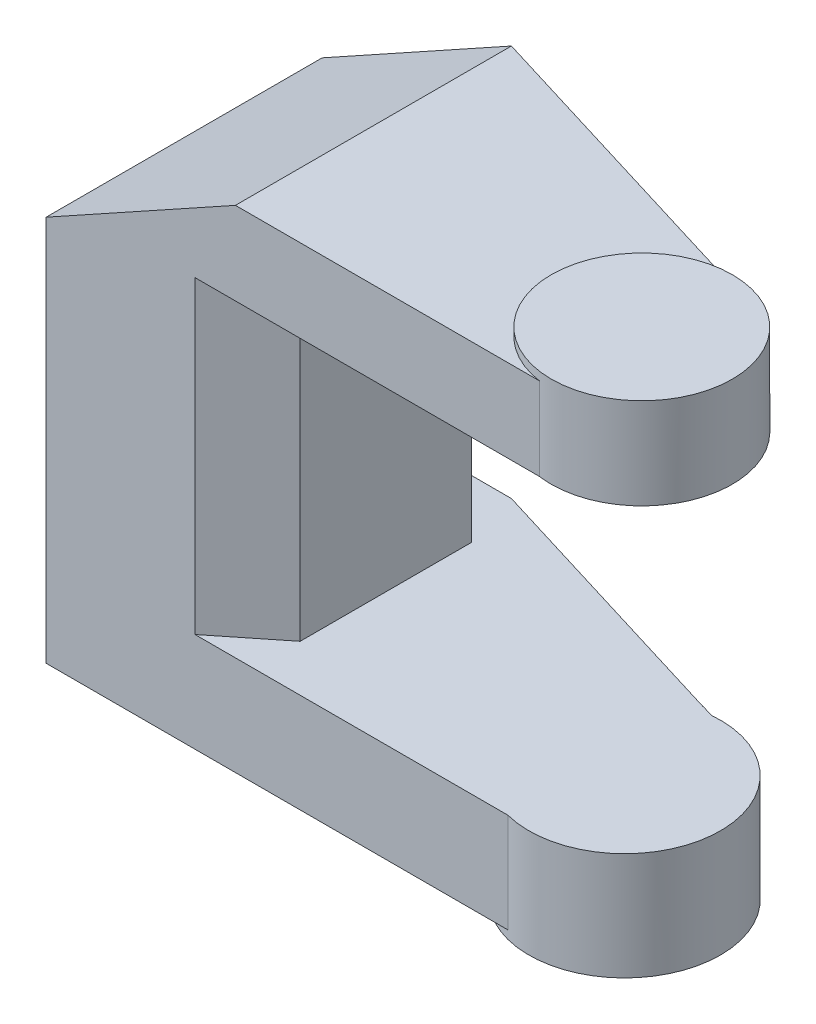
ISO-10303-21;
HEADER;
FILE_DESCRIPTION(('STEP AP214'),'2;1');
FILE_NAME('part.step','',(''),(''),'','','');
FILE_SCHEMA(('AUTOMOTIVE_DESIGN { 1 0 10303 214 1 1 1 1 }'));
ENDSEC;
DATA;
#1=APPLICATION_CONTEXT('core data for automotive mechanical design processes');
#2=APPLICATION_PROTOCOL_DEFINITION('international standard','automotive_design',2000,#1);
#3=PRODUCT_CONTEXT('',#1,'mechanical');
#4=PRODUCT('Part','Part','',(#3));
#5=PRODUCT_RELATED_PRODUCT_CATEGORY('part','',(#4));
#6=PRODUCT_DEFINITION_FORMATION('','',#4);
#7=PRODUCT_DEFINITION_CONTEXT('part definition',#1,'design');
#8=PRODUCT_DEFINITION('design','',#6,#7);
#9=PRODUCT_DEFINITION_SHAPE('','',#8);
#10=(LENGTH_UNIT() NAMED_UNIT(*) SI_UNIT(.MILLI.,.METRE.));
#11=(NAMED_UNIT(*) PLANE_ANGLE_UNIT() SI_UNIT($,.RADIAN.));
#12=(NAMED_UNIT(*) SI_UNIT($,.STERADIAN.) SOLID_ANGLE_UNIT());
#13=UNCERTAINTY_MEASURE_WITH_UNIT(LENGTH_MEASURE(1.E-05),#10,'distance_accuracy_value','');
#14=(GEOMETRIC_REPRESENTATION_CONTEXT(3) GLOBAL_UNCERTAINTY_ASSIGNED_CONTEXT((#13)) GLOBAL_UNIT_ASSIGNED_CONTEXT((#10,
#11,#12)) REPRESENTATION_CONTEXT('',''));
#15=CARTESIAN_POINT('',(0.,0.,0.));
#16=DIRECTION('',(0.,0.,1.));
#17=DIRECTION('',(1.,0.,0.));
#18=AXIS2_PLACEMENT_3D('',#15,#16,#17);
#19=CARTESIAN_POINT('',(421.438035453046,370.,-250.));
#20=DIRECTION('',(0.,1.,0.));
#21=DIRECTION('',(-1.,0.,0.));
#22=AXIS2_PLACEMENT_3D('',#19,#20,#21);
#23=PLANE('',#22);
#24=DIRECTION('',(0.781457807213603,0.,-0.623958087971385));
#25=VECTOR('',#24,1.);
#26=CARTESIAN_POINT('',(134.808708211828,370.,0.));
#27=LINE('',#26,#25);
#28=CARTESIAN_POINT('',(134.808708211828,370.,0.));
#29=VERTEX_POINT('',#28);
#30=CARTESIAN_POINT('',(187.780197762606,370.,-42.2952960889234));
#31=VERTEX_POINT('',#30);
#32=EDGE_CURVE('E54',#29,#31,#27,.T.);
#33=ORIENTED_EDGE('',*,*,#32,.T.);
#34=DIRECTION('',(0.,0.,-1.));
#35=VECTOR('',#34,1.);
#36=CARTESIAN_POINT('',(187.780197762606,370.,-42.2952960889234));
#37=LINE('',#36,#35);
#38=CARTESIAN_POINT('',(187.780197762606,370.,-197.600080778614));
#39=VERTEX_POINT('',#38);
#40=EDGE_CURVE('E58',#31,#39,#37,.T.);
#41=ORIENTED_EDGE('',*,*,#40,.T.);
#42=DIRECTION('',(-0.710931909700484,0.,-0.703260847601815));
#43=VECTOR('',#42,1.);
#44=CARTESIAN_POINT('',(187.780197762606,370.,-197.600080778614));
#45=LINE('',#44,#43);
#46=CARTESIAN_POINT('',(134.808708211828,370.,-250.));
#47=VERTEX_POINT('',#46);
#48=EDGE_CURVE('E294',#39,#47,#45,.T.);
#49=ORIENTED_EDGE('',*,*,#48,.T.);
#50=DIRECTION('',(-1.,0.,0.));
#51=VECTOR('',#50,1.);
#52=CARTESIAN_POINT('',(421.438035453046,370.,-250.));
#53=LINE('',#52,#51);
#54=CARTESIAN_POINT('',(171.438035453046,370.,-250.));
#55=VERTEX_POINT('',#54);
#56=EDGE_CURVE('E219',#55,#47,#53,.T.);
#57=ORIENTED_EDGE('',*,*,#56,.F.);
#58=DIRECTION('',(0.956304755963036,0.,0.292371704722734));
#59=VECTOR('',#58,1.);
#60=CARTESIAN_POINT('',(400.067732022427,370.,-180.100887066157));
#61=LINE('',#60,#59);
#62=CARTESIAN_POINT('',(421.438035453046,370.,-173.567329635336));
#63=VERTEX_POINT('',#62);
#64=EDGE_CURVE('E211',#55,#63,#61,.T.);
#65=ORIENTED_EDGE('',*,*,#64,.T.);
#66=DIRECTION('',(0.957269223575964,0.,0.289198260012523));
#67=VECTOR('',#66,1.);
#68=CARTESIAN_POINT('',(458.366845573691,370.,-162.410857278136));
#69=LINE('',#68,#67);
#70=CARTESIAN_POINT('',(455.863286469266,370.,-163.167201385945));
#71=VERTEX_POINT('',#70);
#72=EDGE_CURVE('E259',#63,#71,#69,.T.);
#73=ORIENTED_EDGE('',*,*,#72,.T.);
#74=CARTESIAN_POINT('',(458.366845573691,370.,-81.205428639068));
#75=DIRECTION('',(0.,1.,0.));
#76=DIRECTION('',(-1.,0.,0.));
#77=AXIS2_PLACEMENT_3D('',#74,#75,#76);
#78=CIRCLE('',#77,81.9999999999999);
#79=CARTESIAN_POINT('',(446.979204924934,370.,0.));
#80=VERTEX_POINT('',#79);
#81=EDGE_CURVE('E254',#71,#80,#78,.F.);
#82=ORIENTED_EDGE('',*,*,#81,.T.);
#83=DIRECTION('',(-1.,0.,0.));
#84=VECTOR('',#83,1.);
#85=CARTESIAN_POINT('',(421.438035453046,370.,0.));
#86=LINE('',#85,#84);
#87=EDGE_CURVE('E170',#80,#29,#86,.T.);
#88=ORIENTED_EDGE('',*,*,#87,.T.);
#89=EDGE_LOOP('',(#33,#41,#49,#57,#65,#73,#82,#88));
#90=FACE_BOUND('',#89,.T.);
#91=ADVANCED_FACE('F39',(#90),#23,.F.);
#92=CARTESIAN_POINT('',(134.808708211828,90.,-250.));
#93=DIRECTION('',(0.,-1.,0.));
#94=DIRECTION('',(0.,0.,-1.));
#95=AXIS2_PLACEMENT_3D('',#92,#93,#94);
#96=PLANE('',#95);
#97=DIRECTION('',(0.781457807213603,0.,-0.623958087971385));
#98=VECTOR('',#97,1.);
#99=CARTESIAN_POINT('',(134.808708211828,90.,0.));
#100=LINE('',#99,#98);
#101=CARTESIAN_POINT('',(134.808708211828,90.,0.));
#102=VERTEX_POINT('',#101);
#103=CARTESIAN_POINT('',(187.780197762606,90.,-42.2952960889234));
#104=VERTEX_POINT('',#103);
#105=EDGE_CURVE('E160',#102,#104,#100,.T.);
#106=ORIENTED_EDGE('',*,*,#105,.F.);
#107=DIRECTION('',(1.,0.,0.));
#108=VECTOR('',#107,1.);
#109=CARTESIAN_POINT('',(134.808708211828,90.,0.));
#110=LINE('',#109,#108);
#111=CARTESIAN_POINT('',(418.196086358207,90.,0.));
#112=VERTEX_POINT('',#111);
#113=EDGE_CURVE('E147',#102,#112,#110,.T.);
#114=ORIENTED_EDGE('',*,*,#113,.T.);
#115=CARTESIAN_POINT('',(440.,90.,-84.0378724923398));
#116=DIRECTION('',(0.,1.,0.));
#117=DIRECTION('',(0.,0.,1.));
#118=AXIS2_PLACEMENT_3D('',#115,#116,#117);
#119=CIRCLE('',#118,86.8203585752647);
#120=CARTESIAN_POINT('',(432.068632190301,90.,-170.495191834341));
#121=VERTEX_POINT('',#120);
#122=EDGE_CURVE('E245',#112,#121,#119,.T.);
#123=ORIENTED_EDGE('',*,*,#122,.T.);
#124=DIRECTION('',(0.956487174232322,0.,0.29177437435297));
#125=VECTOR('',#124,1.);
#126=CARTESIAN_POINT('',(171.438035453046,90.,-250.));
#127=LINE('',#126,#125);
#128=CARTESIAN_POINT('',(421.438035453046,90.,-173.738032716657));
#129=VERTEX_POINT('',#128);
#130=EDGE_CURVE('E262',#129,#121,#127,.T.);
#131=ORIENTED_EDGE('',*,*,#130,.F.);
#132=DIRECTION('',(0.,0.,1.));
#133=VECTOR('',#132,1.);
#134=CARTESIAN_POINT('',(421.438035453046,90.,-250.));
#135=LINE('',#134,#133);
#136=CARTESIAN_POINT('',(421.438035453046,90.,-173.567329635336));
#137=VERTEX_POINT('',#136);
#138=EDGE_CURVE('E210',#129,#137,#135,.T.);
#139=ORIENTED_EDGE('',*,*,#138,.T.);
#140=DIRECTION('',(-0.956304755963036,0.,-0.292371704722734));
#141=VECTOR('',#140,1.);
#142=CARTESIAN_POINT('',(137.939827562245,90.,-260.241429926099));
#143=LINE('',#142,#141);
#144=CARTESIAN_POINT('',(171.438035453046,90.,-250.));
#145=VERTEX_POINT('',#144);
#146=EDGE_CURVE('E199',#137,#145,#143,.T.);
#147=ORIENTED_EDGE('',*,*,#146,.T.);
#148=DIRECTION('',(1.,0.,0.));
#149=VECTOR('',#148,1.);
#150=CARTESIAN_POINT('',(134.808708211828,90.,-250.));
#151=LINE('',#150,#149);
#152=CARTESIAN_POINT('',(134.808708211828,90.,-250.));
#153=VERTEX_POINT('',#152);
#154=EDGE_CURVE('E180',#153,#145,#151,.T.);
#155=ORIENTED_EDGE('',*,*,#154,.F.);
#156=DIRECTION('',(-0.710931909700484,0.,-0.703260847601815));
#157=VECTOR('',#156,1.);
#158=CARTESIAN_POINT('',(187.780197762606,90.,-197.600080778614));
#159=LINE('',#158,#157);
#160=CARTESIAN_POINT('',(187.780197762606,90.,-197.600080778614));
#161=VERTEX_POINT('',#160);
#162=EDGE_CURVE('E295',#161,#153,#159,.T.);
#163=ORIENTED_EDGE('',*,*,#162,.F.);
#164=DIRECTION('',(0.,0.,-1.));
#165=VECTOR('',#164,1.);
#166=CARTESIAN_POINT('',(187.780197762606,90.,-42.2952960889234));
#167=LINE('',#166,#165);
#168=EDGE_CURVE('E163',#104,#161,#167,.T.);
#169=ORIENTED_EDGE('',*,*,#168,.F.);
#170=EDGE_LOOP('',(#106,#114,#123,#131,#139,#147,#155,#163,#169));
#171=FACE_BOUND('',#170,.T.);
#172=ADVANCED_FACE('F161',(#171),#96,.F.);
#173=CARTESIAN_POINT('',(360.,0.,-250.));
#174=DIRECTION('',(0.,1.,0.));
#175=DIRECTION('',(-1.,0.,0.));
#176=AXIS2_PLACEMENT_3D('',#173,#174,#175);
#177=PLANE('',#176);
#178=CARTESIAN_POINT('',(440.,0.,-84.0378724923398));
#179=DIRECTION('',(0.,-1.,0.));
#180=DIRECTION('',(1.,0.,0.));
#181=AXIS2_PLACEMENT_3D('',#178,#179,#180);
#182=CIRCLE('',#181,86.8203585752647);
#183=CARTESIAN_POINT('',(418.196086358207,0.,0.));
#184=VERTEX_POINT('',#183);
#185=CARTESIAN_POINT('',(432.068632190301,0.,-170.495191834341));
#186=VERTEX_POINT('',#185);
#187=EDGE_CURVE('E248',#184,#186,#182,.T.);
#188=ORIENTED_EDGE('',*,*,#187,.F.);
#189=DIRECTION('',(-1.,0.,0.));
#190=VECTOR('',#189,1.);
#191=CARTESIAN_POINT('',(360.,0.,0.));
#192=LINE('',#191,#190);
#193=CARTESIAN_POINT('',(0.,0.,0.));
#194=VERTEX_POINT('',#193);
#195=EDGE_CURVE('E223',#184,#194,#192,.T.);
#196=ORIENTED_EDGE('',*,*,#195,.T.);
#197=DIRECTION('',(0.,0.,1.));
#198=VECTOR('',#197,1.);
#199=CARTESIAN_POINT('',(0.,0.,-250.));
#200=LINE('',#199,#198);
#201=CARTESIAN_POINT('',(0.,0.,-250.));
#202=VERTEX_POINT('',#201);
#203=EDGE_CURVE('E183',#202,#194,#200,.T.);
#204=ORIENTED_EDGE('',*,*,#203,.F.);
#205=DIRECTION('',(-1.,0.,0.));
#206=VECTOR('',#205,1.);
#207=CARTESIAN_POINT('',(360.,0.,-250.));
#208=LINE('',#207,#206);
#209=CARTESIAN_POINT('',(171.438035453046,0.,-250.));
#210=VERTEX_POINT('',#209);
#211=EDGE_CURVE('E157',#210,#202,#208,.T.);
#212=ORIENTED_EDGE('',*,*,#211,.F.);
#213=DIRECTION('',(0.956304755963036,0.,0.292371704722734));
#214=VECTOR('',#213,1.);
#215=CARTESIAN_POINT('',(343.881494408632,0.,-197.278743780421));
#216=LINE('',#215,#214);
#217=CARTESIAN_POINT('',(421.438035453046,0.,-173.567329635336));
#218=VERTEX_POINT('',#217);
#219=EDGE_CURVE('E202',#210,#218,#216,.T.);
#220=ORIENTED_EDGE('',*,*,#219,.T.);
#221=DIRECTION('',(0.,0.,-1.));
#222=VECTOR('',#221,1.);
#223=CARTESIAN_POINT('',(421.438035453046,0.,-250.));
#224=LINE('',#223,#222);
#225=CARTESIAN_POINT('',(421.438035453046,0.,-173.738032716657));
#226=VERTEX_POINT('',#225);
#227=EDGE_CURVE('E226',#218,#226,#224,.T.);
#228=ORIENTED_EDGE('',*,*,#227,.T.);
#229=DIRECTION('',(0.956487174232322,0.,0.29177437435297));
#230=VECTOR('',#229,1.);
#231=CARTESIAN_POINT('',(343.947288994267,0.,-197.376419801462));
#232=LINE('',#231,#230);
#233=EDGE_CURVE('E268',#226,#186,#232,.T.);
#234=ORIENTED_EDGE('',*,*,#233,.T.);
#235=EDGE_LOOP('',(#188,#196,#204,#212,#220,#228,#234));
#236=FACE_BOUND('',#235,.T.);
#237=ADVANCED_FACE('F41',(#236),#177,.F.);
#238=CARTESIAN_POINT('',(171.438035453046,445.,-250.));
#239=DIRECTION('',(0.,-1.,0.));
#240=DIRECTION('',(0.,0.,-1.));
#241=AXIS2_PLACEMENT_3D('',#238,#239,#240);
#242=PLANE('',#241);
#243=CARTESIAN_POINT('',(458.366845573691,445.,-81.205428639068));
#244=DIRECTION('',(0.,1.,0.));
#245=DIRECTION('',(0.,0.,1.));
#246=AXIS2_PLACEMENT_3D('',#243,#244,#245);
#247=CIRCLE('',#246,81.9999999999999);
#248=CARTESIAN_POINT('',(455.863286469266,445.,-163.167201385945));
#249=VERTEX_POINT('',#248);
#250=CARTESIAN_POINT('',(446.979204924934,445.,0.));
#251=VERTEX_POINT('',#250);
#252=EDGE_CURVE('E233',#249,#251,#247,.T.);
#253=ORIENTED_EDGE('',*,*,#252,.F.);
#254=DIRECTION('',(-0.957269223575964,0.,-0.289198260012523));
#255=VECTOR('',#254,1.);
#256=CARTESIAN_POINT('',(458.366845573691,445.,-162.410857278136));
#257=LINE('',#256,#255);
#258=CARTESIAN_POINT('',(421.438035453046,445.,-173.567329635336));
#259=VERTEX_POINT('',#258);
#260=EDGE_CURVE('E257',#249,#259,#257,.T.);
#261=ORIENTED_EDGE('',*,*,#260,.T.);
#262=DIRECTION('',(0.956304755963036,0.,0.292371704722734));
#263=VECTOR('',#262,1.);
#264=CARTESIAN_POINT('',(171.438035453046,445.,-250.));
#265=LINE('',#264,#263);
#266=CARTESIAN_POINT('',(171.438035453046,445.,-250.));
#267=VERTEX_POINT('',#266);
#268=EDGE_CURVE('E271',#267,#259,#265,.T.);
#269=ORIENTED_EDGE('',*,*,#268,.F.);
#270=DIRECTION('',(0.,0.,1.));
#271=VECTOR('',#270,1.);
#272=CARTESIAN_POINT('',(171.438035453046,445.,-250.));
#273=LINE('',#272,#271);
#274=CARTESIAN_POINT('',(171.438035453046,445.,0.));
#275=VERTEX_POINT('',#274);
#276=EDGE_CURVE('E176',#267,#275,#273,.T.);
#277=ORIENTED_EDGE('',*,*,#276,.T.);
#278=DIRECTION('',(1.,0.,0.));
#279=VECTOR('',#278,1.);
#280=CARTESIAN_POINT('',(171.438035453046,445.,0.));
#281=LINE('',#280,#279);
#282=EDGE_CURVE('E172',#275,#251,#281,.T.);
#283=ORIENTED_EDGE('',*,*,#282,.T.);
#284=EDGE_LOOP('',(#253,#261,#269,#277,#283));
#285=FACE_BOUND('',#284,.T.);
#286=ADVANCED_FACE('F232',(#285),#242,.F.);
#287=CARTESIAN_POINT('',(0.,0.,-250.));
#288=DIRECTION('',(1.,0.,0.));
#289=DIRECTION('',(0.,0.,-1.));
#290=AXIS2_PLACEMENT_3D('',#287,#288,#289);
#291=PLANE('',#290);
#292=DIRECTION('',(0.,1.,0.));
#293=VECTOR('',#292,1.);
#294=CARTESIAN_POINT('',(0.,0.,0.));
#295=LINE('',#294,#293);
#296=CARTESIAN_POINT('',(0.,350.,0.));
#297=VERTEX_POINT('',#296);
#298=EDGE_CURVE('E225',#194,#297,#295,.T.);
#299=ORIENTED_EDGE('',*,*,#298,.T.);
#300=DIRECTION('',(0.,0.,1.));
#301=VECTOR('',#300,1.);
#302=CARTESIAN_POINT('',(0.,350.,-250.));
#303=LINE('',#302,#301);
#304=CARTESIAN_POINT('',(0.,350.,-250.));
#305=VERTEX_POINT('',#304);
#306=EDGE_CURVE('E179',#305,#297,#303,.T.);
#307=ORIENTED_EDGE('',*,*,#306,.F.);
#308=DIRECTION('',(0.,1.,0.));
#309=VECTOR('',#308,1.);
#310=CARTESIAN_POINT('',(0.,0.,-250.));
#311=LINE('',#310,#309);
#312=EDGE_CURVE('E284',#202,#305,#311,.T.);
#313=ORIENTED_EDGE('',*,*,#312,.F.);
#314=ORIENTED_EDGE('',*,*,#203,.T.);
#315=EDGE_LOOP('',(#299,#307,#313,#314));
#316=FACE_BOUND('',#315,.T.);
#317=ADVANCED_FACE('F319',(#316),#291,.F.);
#318=CARTESIAN_POINT('',(0.,350.,-250.));
#319=DIRECTION('',(0.484693877551021,-0.874683854352277,0.));
#320=DIRECTION('',(0.874683854352277,0.484693877551021,0.));
#321=AXIS2_PLACEMENT_3D('',#318,#319,#320);
#322=PLANE('',#321);
#323=DIRECTION('',(0.874683854352277,0.484693877551021,0.));
#324=VECTOR('',#323,1.);
#325=CARTESIAN_POINT('',(0.,350.,0.));
#326=LINE('',#325,#324);
#327=EDGE_CURVE('E228',#297,#275,#326,.T.);
#328=ORIENTED_EDGE('',*,*,#327,.T.);
#329=ORIENTED_EDGE('',*,*,#276,.F.);
#330=DIRECTION('',(0.874683854352277,0.484693877551021,0.));
#331=VECTOR('',#330,1.);
#332=CARTESIAN_POINT('',(0.,350.,-250.));
#333=LINE('',#332,#331);
#334=EDGE_CURVE('E286',#305,#267,#333,.T.);
#335=ORIENTED_EDGE('',*,*,#334,.F.);
#336=ORIENTED_EDGE('',*,*,#306,.T.);
#337=EDGE_LOOP('',(#328,#329,#335,#336));
#338=FACE_BOUND('',#337,.T.);
#339=ADVANCED_FACE('F322',(#338),#322,.F.);
#340=CARTESIAN_POINT('',(0.,0.,-250.));
#341=DIRECTION('',(0.,0.,-1.));
#342=DIRECTION('',(-1.,0.,0.));
#343=AXIS2_PLACEMENT_3D('',#340,#341,#342);
#344=PLANE('',#343);
#345=DIRECTION('',(0.,1.,0.));
#346=VECTOR('',#345,1.);
#347=CARTESIAN_POINT('',(171.438035453046,0.,-250.));
#348=LINE('',#347,#346);
#349=EDGE_CURVE('E187',#210,#145,#348,.T.);
#350=ORIENTED_EDGE('',*,*,#349,.F.);
#351=ORIENTED_EDGE('',*,*,#211,.T.);
#352=ORIENTED_EDGE('',*,*,#312,.T.);
#353=ORIENTED_EDGE('',*,*,#334,.T.);
#354=EDGE_CURVE('E186',#55,#267,#348,.T.);
#355=ORIENTED_EDGE('',*,*,#354,.F.);
#356=ORIENTED_EDGE('',*,*,#56,.T.);
#357=DIRECTION('',(0.,-1.,0.));
#358=VECTOR('',#357,1.);
#359=CARTESIAN_POINT('',(134.808708211828,370.,-250.));
#360=LINE('',#359,#358);
#361=EDGE_CURVE('E217',#47,#153,#360,.T.);
#362=ORIENTED_EDGE('',*,*,#361,.T.);
#363=ORIENTED_EDGE('',*,*,#154,.T.);
#364=EDGE_LOOP('',(#350,#351,#352,#353,#355,#356,#362,#363));
#365=FACE_BOUND('',#364,.T.);
#366=ADVANCED_FACE('F214',(#365),#344,.T.);
#367=CARTESIAN_POINT('',(0.,0.,0.));
#368=DIRECTION('',(0.,0.,-1.));
#369=DIRECTION('',(-1.,0.,0.));
#370=AXIS2_PLACEMENT_3D('',#367,#368,#369);
#371=PLANE('',#370);
#372=ORIENTED_EDGE('',*,*,#195,.F.);
#373=DIRECTION('',(0.,1.,0.));
#374=VECTOR('',#373,1.);
#375=CARTESIAN_POINT('',(418.196086358207,-245.565057174469,0.));
#376=LINE('',#375,#374);
#377=EDGE_CURVE('E154',#184,#112,#376,.T.);
#378=ORIENTED_EDGE('',*,*,#377,.T.);
#379=ORIENTED_EDGE('',*,*,#113,.F.);
#380=DIRECTION('',(0.,-1.,0.));
#381=VECTOR('',#380,1.);
#382=CARTESIAN_POINT('',(134.808708211828,370.,0.));
#383=LINE('',#382,#381);
#384=EDGE_CURVE('E152',#29,#102,#383,.T.);
#385=ORIENTED_EDGE('',*,*,#384,.F.);
#386=ORIENTED_EDGE('',*,*,#87,.F.);
#387=DIRECTION('',(0.,1.,0.));
#388=VECTOR('',#387,1.);
#389=CARTESIAN_POINT('',(446.979204924934,138.068975770813,0.));
#390=LINE('',#389,#388);
#391=EDGE_CURVE('E239',#80,#251,#390,.T.);
#392=ORIENTED_EDGE('',*,*,#391,.T.);
#393=ORIENTED_EDGE('',*,*,#282,.F.);
#394=ORIENTED_EDGE('',*,*,#327,.F.);
#395=ORIENTED_EDGE('',*,*,#298,.F.);
#396=EDGE_LOOP('',(#372,#378,#379,#385,#386,#392,#393,#394,#395));
#397=FACE_BOUND('',#396,.T.);
#398=ADVANCED_FACE('F149',(#397),#371,.F.);
#399=CARTESIAN_POINT('',(171.438035453046,-55.0000000000001,-250.));
#400=DIRECTION('',(-0.292371704722734,0.,0.956304755963036));
#401=DIRECTION('',(0.956304755963036,0.,0.292371704722734));
#402=AXIS2_PLACEMENT_3D('',#399,#400,#401);
#403=PLANE('',#402);
#404=ORIENTED_EDGE('',*,*,#354,.T.);
#405=ORIENTED_EDGE('',*,*,#268,.T.);
#406=DIRECTION('',(0.,1.,0.));
#407=VECTOR('',#406,1.);
#408=CARTESIAN_POINT('',(421.438035453046,-55.0000000000001,-173.567329635336));
#409=LINE('',#408,#407);
#410=EDGE_CURVE('E274',#63,#259,#409,.T.);
#411=ORIENTED_EDGE('',*,*,#410,.F.);
#412=ORIENTED_EDGE('',*,*,#64,.F.);
#413=EDGE_LOOP('',(#404,#405,#411,#412));
#414=FACE_BOUND('',#413,.T.);
#415=ADVANCED_FACE('F373',(#414),#403,.F.);
#416=CARTESIAN_POINT('',(421.438035453046,-55.0000000000001,-173.567329635336));
#417=DIRECTION('',(1.,0.,0.));
#418=DIRECTION('',(0.,0.,-1.));
#419=AXIS2_PLACEMENT_3D('',#416,#417,#418);
#420=PLANE('',#419);
#421=ORIENTED_EDGE('',*,*,#138,.F.);
#422=DIRECTION('',(0.,-1.,0.));
#423=VECTOR('',#422,1.);
#424=CARTESIAN_POINT('',(421.438035453046,-55.0000000000001,-173.738032716657));
#425=LINE('',#424,#423);
#426=EDGE_CURVE('E265',#129,#226,#425,.T.);
#427=ORIENTED_EDGE('',*,*,#426,.T.);
#428=ORIENTED_EDGE('',*,*,#227,.F.);
#429=EDGE_CURVE('E212',#218,#137,#409,.T.);
#430=ORIENTED_EDGE('',*,*,#429,.T.);
#431=EDGE_LOOP('',(#421,#427,#428,#430));
#432=FACE_BOUND('',#431,.T.);
#433=ADVANCED_FACE('F314',(#432),#420,.F.);
#434=ORIENTED_EDGE('',*,*,#349,.T.);
#435=ORIENTED_EDGE('',*,*,#146,.F.);
#436=ORIENTED_EDGE('',*,*,#429,.F.);
#437=ORIENTED_EDGE('',*,*,#219,.F.);
#438=EDGE_LOOP('',(#434,#435,#436,#437));
#439=FACE_BOUND('',#438,.T.);
#440=ADVANCED_FACE('F197',(#439),#403,.F.);
#441=CARTESIAN_POINT('',(171.438035453046,-410.,-250.));
#442=DIRECTION('',(-0.29177437435297,0.,0.956487174232322));
#443=DIRECTION('',(0.956487174232322,0.,0.29177437435297));
#444=AXIS2_PLACEMENT_3D('',#441,#442,#443);
#445=PLANE('',#444);
#446=ORIENTED_EDGE('',*,*,#130,.T.);
#447=DIRECTION('',(0.,1.,0.));
#448=VECTOR('',#447,1.);
#449=CARTESIAN_POINT('',(432.068632190301,-245.565057174469,-170.495191834341));
#450=LINE('',#449,#448);
#451=EDGE_CURVE('E11',#121,#186,#450,.F.);
#452=ORIENTED_EDGE('',*,*,#451,.T.);
#453=ORIENTED_EDGE('',*,*,#233,.F.);
#454=ORIENTED_EDGE('',*,*,#426,.F.);
#455=EDGE_LOOP('',(#446,#452,#453,#454));
#456=FACE_BOUND('',#455,.T.);
#457=ADVANCED_FACE('F312',(#456),#445,.F.);
#458=CARTESIAN_POINT('',(458.366845573691,192.086546499993,-162.410857278136));
#459=DIRECTION('',(0.289198260012523,0.,-0.957269223575964));
#460=DIRECTION('',(-0.957269223575964,0.,-0.289198260012523));
#461=AXIS2_PLACEMENT_3D('',#458,#459,#460);
#462=PLANE('',#461);
#463=DIRECTION('',(0.,1.,0.));
#464=VECTOR('',#463,1.);
#465=CARTESIAN_POINT('',(455.863286469266,138.068975770813,-163.167201385945));
#466=LINE('',#465,#464);
#467=EDGE_CURVE('E47',#71,#249,#466,.T.);
#468=ORIENTED_EDGE('',*,*,#467,.F.);
#469=ORIENTED_EDGE('',*,*,#72,.F.);
#470=ORIENTED_EDGE('',*,*,#410,.T.);
#471=ORIENTED_EDGE('',*,*,#260,.F.);
#472=EDGE_LOOP('',(#468,#469,#470,#471));
#473=FACE_BOUND('',#472,.T.);
#474=ADVANCED_FACE('F418',(#473),#462,.T.);
#475=CARTESIAN_POINT('',(458.366845573691,138.068975770813,-81.205428639068));
#476=DIRECTION('',(0.,1.,0.));
#477=DIRECTION('',(0.,0.,1.));
#478=AXIS2_PLACEMENT_3D('',#475,#476,#477);
#479=CYLINDRICAL_SURFACE('',#478,81.9999999999999);
#480=ORIENTED_EDGE('',*,*,#391,.F.);
#481=ORIENTED_EDGE('',*,*,#81,.F.);
#482=ORIENTED_EDGE('',*,*,#467,.T.);
#483=ORIENTED_EDGE('',*,*,#252,.T.);
#484=EDGE_LOOP('',(#480,#481,#482,#483));
#485=FACE_BOUND('',#484,.T.);
#486=CARTESIAN_POINT('',(458.366845573691,452.5,-81.205428639068));
#487=DIRECTION('',(0.,1.,0.));
#488=DIRECTION('',(0.,0.,1.));
#489=AXIS2_PLACEMENT_3D('',#486,#487,#488);
#490=CIRCLE('',#489,81.9999999999999);
#491=CARTESIAN_POINT('',(458.366845573691,452.5,0.794571360931987));
#492=VERTEX_POINT('',#491);
#493=EDGE_CURVE('E241',#492,#492,#490,.T.);
#494=ORIENTED_EDGE('',*,*,#493,.F.);
#495=EDGE_LOOP('',(#494));
#496=FACE_BOUND('',#495,.T.);
#497=ADVANCED_FACE('F237',(#485,#496),#479,.T.);
#498=CARTESIAN_POINT('',(440.,-245.565057174469,-84.0378724923398));
#499=DIRECTION('',(0.,1.,0.));
#500=DIRECTION('',(0.,0.,1.));
#501=AXIS2_PLACEMENT_3D('',#498,#499,#500);
#502=CYLINDRICAL_SURFACE('',#501,86.8203585752647);
#503=ORIENTED_EDGE('',*,*,#377,.F.);
#504=ORIENTED_EDGE('',*,*,#187,.T.);
#505=ORIENTED_EDGE('',*,*,#451,.F.);
#506=ORIENTED_EDGE('',*,*,#122,.F.);
#507=EDGE_LOOP('',(#503,#504,#505,#506));
#508=FACE_BOUND('',#507,.T.);
#509=CARTESIAN_POINT('',(440.,-7.5,-84.0378724923398));
#510=DIRECTION('',(0.,-1.,0.));
#511=DIRECTION('',(1.,0.,0.));
#512=AXIS2_PLACEMENT_3D('',#509,#510,#511);
#513=CIRCLE('',#512,86.8203585752647);
#514=CARTESIAN_POINT('',(526.820358575265,-7.5,-84.0378724923398));
#515=VERTEX_POINT('',#514);
#516=EDGE_CURVE('E242',#515,#515,#513,.T.);
#517=ORIENTED_EDGE('',*,*,#516,.F.);
#518=EDGE_LOOP('',(#517));
#519=FACE_BOUND('',#518,.T.);
#520=ADVANCED_FACE('F307',(#508,#519),#502,.T.);
#521=CARTESIAN_POINT('',(458.366845573691,452.5,-81.205428639068));
#522=DIRECTION('',(0.,1.,0.));
#523=DIRECTION('',(0.,0.,1.));
#524=AXIS2_PLACEMENT_3D('',#521,#522,#523);
#525=PLANE('',#524);
#526=ORIENTED_EDGE('',*,*,#493,.T.);
#527=EDGE_LOOP('',(#526));
#528=FACE_BOUND('',#527,.T.);
#529=ADVANCED_FACE('F409',(#528),#525,.T.);
#530=CARTESIAN_POINT('',(440.,-7.5,-84.0378724923398));
#531=DIRECTION('',(0.,-1.,0.));
#532=DIRECTION('',(1.,0.,0.));
#533=AXIS2_PLACEMENT_3D('',#530,#531,#532);
#534=PLANE('',#533);
#535=ORIENTED_EDGE('',*,*,#516,.T.);
#536=EDGE_LOOP('',(#535));
#537=FACE_BOUND('',#536,.T.);
#538=ADVANCED_FACE('F385',(#537),#534,.T.);
#539=CARTESIAN_POINT('',(134.808708211828,625.550344756622,0.));
#540=DIRECTION('',(-0.623958087971385,0.,-0.781457807213603));
#541=DIRECTION('',(-0.781457807213603,0.,0.623958087971385));
#542=AXIS2_PLACEMENT_3D('',#539,#540,#541);
#543=PLANE('',#542);
#544=ORIENTED_EDGE('',*,*,#32,.F.);
#545=ORIENTED_EDGE('',*,*,#384,.T.);
#546=ORIENTED_EDGE('',*,*,#105,.T.);
#547=DIRECTION('',(0.,-1.,0.));
#548=VECTOR('',#547,1.);
#549=CARTESIAN_POINT('',(187.780197762606,625.550344756622,-42.2952960889234));
#550=LINE('',#549,#548);
#551=EDGE_CURVE('E167',#31,#104,#550,.T.);
#552=ORIENTED_EDGE('',*,*,#551,.F.);
#553=EDGE_LOOP('',(#544,#545,#546,#552));
#554=FACE_BOUND('',#553,.T.);
#555=ADVANCED_FACE('F169',(#554),#543,.F.);
#556=CARTESIAN_POINT('',(187.780197762606,625.550344756622,-42.2952960889234));
#557=DIRECTION('',(-1.,0.,0.));
#558=DIRECTION('',(0.,0.,1.));
#559=AXIS2_PLACEMENT_3D('',#556,#557,#558);
#560=PLANE('',#559);
#561=ORIENTED_EDGE('',*,*,#40,.F.);
#562=ORIENTED_EDGE('',*,*,#551,.T.);
#563=ORIENTED_EDGE('',*,*,#168,.T.);
#564=DIRECTION('',(0.,-1.,0.));
#565=VECTOR('',#564,1.);
#566=CARTESIAN_POINT('',(187.780197762606,625.550344756622,-197.600080778614));
#567=LINE('',#566,#565);
#568=EDGE_CURVE('E296',#39,#161,#567,.T.);
#569=ORIENTED_EDGE('',*,*,#568,.F.);
#570=EDGE_LOOP('',(#561,#562,#563,#569));
#571=FACE_BOUND('',#570,.T.);
#572=ADVANCED_FACE('F384',(#571),#560,.F.);
#573=CARTESIAN_POINT('',(187.780197762606,625.550344756622,-197.600080778614));
#574=DIRECTION('',(-0.703260847601815,0.,0.710931909700484));
#575=DIRECTION('',(0.710931909700484,0.,0.703260847601815));
#576=AXIS2_PLACEMENT_3D('',#573,#574,#575);
#577=PLANE('',#576);
#578=ORIENTED_EDGE('',*,*,#48,.F.);
#579=ORIENTED_EDGE('',*,*,#568,.T.);
#580=ORIENTED_EDGE('',*,*,#162,.T.);
#581=ORIENTED_EDGE('',*,*,#361,.F.);
#582=EDGE_LOOP('',(#578,#579,#580,#581));
#583=FACE_BOUND('',#582,.T.);
#584=ADVANCED_FACE('F292',(#583),#577,.F.);
#585=CLOSED_SHELL('',(#91,#172,#237,#286,#317,#339,#366,#398,#415,#433,#440,#457,#474,#497,#520,
#529,#538,#555,#572,#584));
#586=MANIFOLD_SOLID_BREP('B2',#585);
#587=ADVANCED_BREP_SHAPE_REPRESENTATION('',(#18,#586),#14);
#588=SHAPE_DEFINITION_REPRESENTATION(#9,#587);
ENDSEC;
END-ISO-10303-21;
